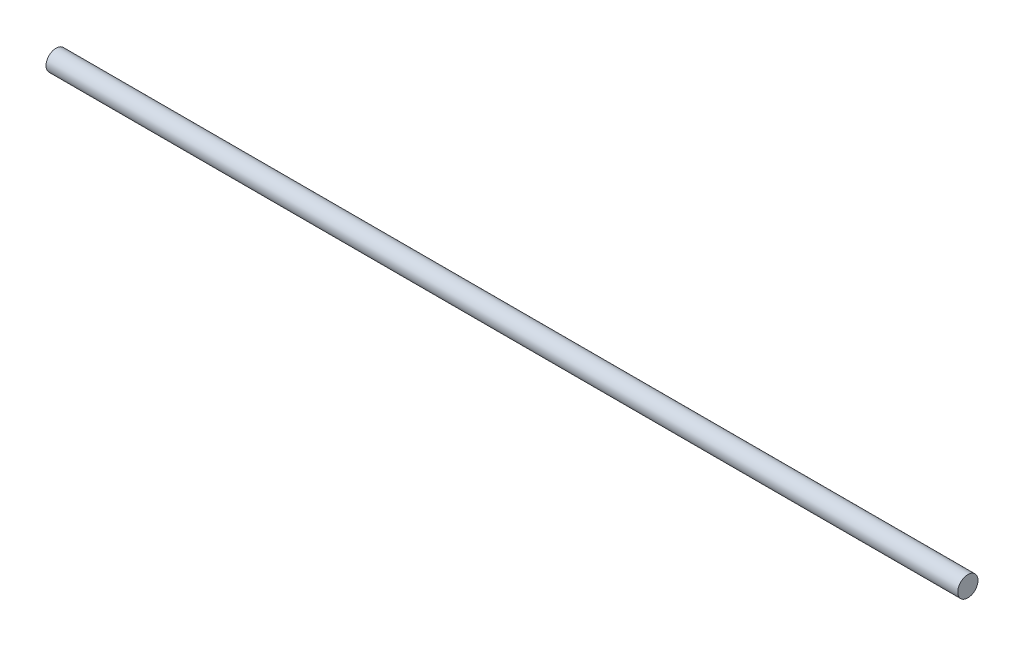
ISO-10303-21;
HEADER;
FILE_DESCRIPTION(('STEP AP214'),'2;1');
FILE_NAME('part.step','',(''),(''),'','','');
FILE_SCHEMA(('AUTOMOTIVE_DESIGN { 1 0 10303 214 1 1 1 1 }'));
ENDSEC;
DATA;
#1=APPLICATION_CONTEXT('core data for automotive mechanical design processes');
#2=APPLICATION_PROTOCOL_DEFINITION('international standard','automotive_design',2000,#1);
#3=PRODUCT_CONTEXT('',#1,'mechanical');
#4=PRODUCT('Part','Part','',(#3));
#5=PRODUCT_RELATED_PRODUCT_CATEGORY('part','',(#4));
#6=PRODUCT_DEFINITION_FORMATION('','',#4);
#7=PRODUCT_DEFINITION_CONTEXT('part definition',#1,'design');
#8=PRODUCT_DEFINITION('design','',#6,#7);
#9=PRODUCT_DEFINITION_SHAPE('','',#8);
#10=(LENGTH_UNIT() NAMED_UNIT(*) SI_UNIT(.MILLI.,.METRE.));
#11=(NAMED_UNIT(*) PLANE_ANGLE_UNIT() SI_UNIT($,.RADIAN.));
#12=(NAMED_UNIT(*) SI_UNIT($,.STERADIAN.) SOLID_ANGLE_UNIT());
#13=UNCERTAINTY_MEASURE_WITH_UNIT(LENGTH_MEASURE(1.E-05),#10,'distance_accuracy_value','');
#14=(GEOMETRIC_REPRESENTATION_CONTEXT(3) GLOBAL_UNCERTAINTY_ASSIGNED_CONTEXT((#13)) GLOBAL_UNIT_ASSIGNED_CONTEXT((#10,
#11,#12)) REPRESENTATION_CONTEXT('',''));
#15=CARTESIAN_POINT('',(0.,0.,0.));
#16=DIRECTION('',(0.,0.,1.));
#17=DIRECTION('',(1.,0.,0.));
#18=AXIS2_PLACEMENT_3D('',#15,#16,#17);
#19=CARTESIAN_POINT('',(342.9,0.,0.));
#20=DIRECTION('',(-1.,0.,0.));
#21=DIRECTION('',(0.,0.,1.));
#22=AXIS2_PLACEMENT_3D('',#19,#20,#21);
#23=CYLINDRICAL_SURFACE('',#22,3.81);
#24=CARTESIAN_POINT('',(342.9,0.,0.));
#25=DIRECTION('',(1.,0.,0.));
#26=DIRECTION('',(0.,0.,-1.));
#27=AXIS2_PLACEMENT_3D('',#24,#25,#26);
#28=CIRCLE('',#27,3.81);
#29=CARTESIAN_POINT('',(342.9,0.,-3.81));
#30=VERTEX_POINT('',#29);
#31=EDGE_CURVE('E10',#30,#30,#28,.T.);
#32=ORIENTED_EDGE('',*,*,#31,.F.);
#33=EDGE_LOOP('',(#32));
#34=FACE_BOUND('',#33,.T.);
#35=CARTESIAN_POINT('',(0.,0.,0.));
#36=DIRECTION('',(1.,0.,0.));
#37=DIRECTION('',(0.,0.,-1.));
#38=AXIS2_PLACEMENT_3D('',#35,#36,#37);
#39=CIRCLE('',#38,3.81);
#40=CARTESIAN_POINT('',(0.,0.,-3.81));
#41=VERTEX_POINT('',#40);
#42=EDGE_CURVE('E40',#41,#41,#39,.T.);
#43=ORIENTED_EDGE('',*,*,#42,.T.);
#44=EDGE_LOOP('',(#43));
#45=FACE_BOUND('',#44,.T.);
#46=ADVANCED_FACE('F37',(#34,#45),#23,.T.);
#47=CARTESIAN_POINT('',(342.9,0.,0.));
#48=DIRECTION('',(1.,0.,0.));
#49=DIRECTION('',(0.,0.,-1.));
#50=AXIS2_PLACEMENT_3D('',#47,#48,#49);
#51=PLANE('',#50);
#52=ORIENTED_EDGE('',*,*,#31,.T.);
#53=EDGE_LOOP('',(#52));
#54=FACE_BOUND('',#53,.T.);
#55=ADVANCED_FACE('F52',(#54),#51,.T.);
#56=CARTESIAN_POINT('',(0.,0.,0.));
#57=DIRECTION('',(1.,0.,0.));
#58=DIRECTION('',(0.,0.,-1.));
#59=AXIS2_PLACEMENT_3D('',#56,#57,#58);
#60=PLANE('',#59);
#61=ORIENTED_EDGE('',*,*,#42,.F.);
#62=EDGE_LOOP('',(#61));
#63=FACE_BOUND('',#62,.T.);
#64=ADVANCED_FACE('F50',(#63),#60,.F.);
#65=CLOSED_SHELL('',(#46,#55,#64));
#66=MANIFOLD_SOLID_BREP('B2',#65);
#67=ADVANCED_BREP_SHAPE_REPRESENTATION('',(#18,#66),#14);
#68=SHAPE_DEFINITION_REPRESENTATION(#9,#67);
ENDSEC;
END-ISO-10303-21;
